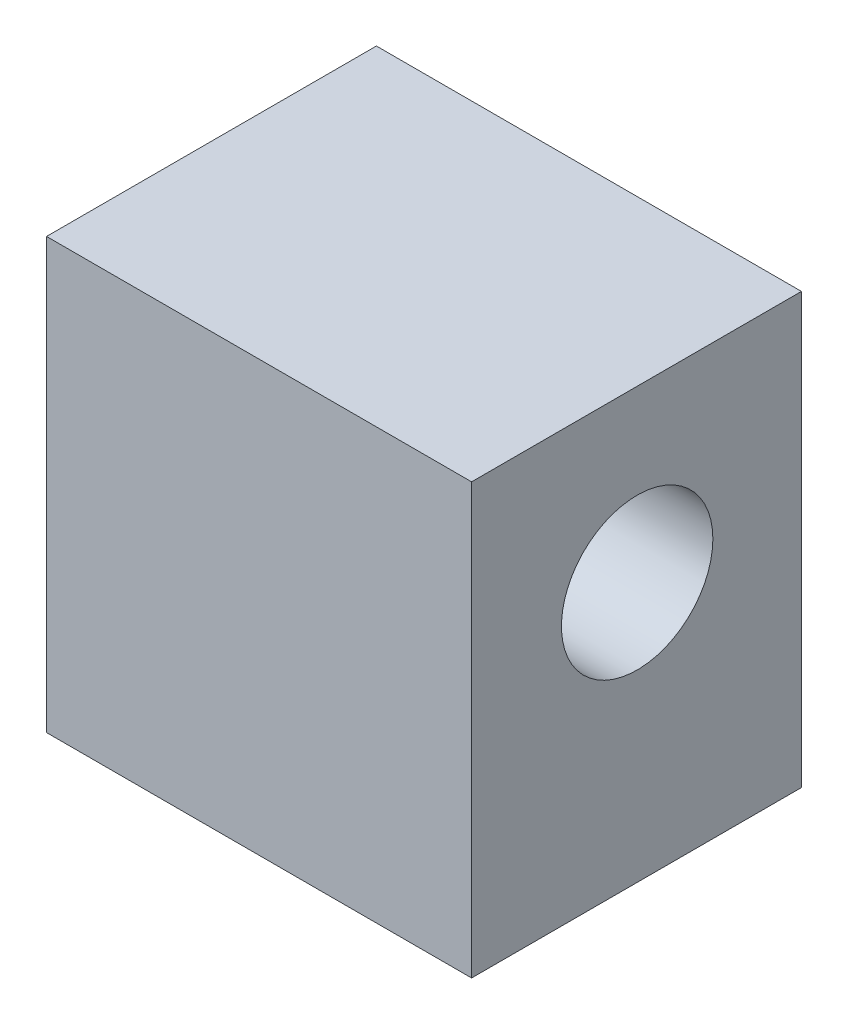
ISO-10303-21;
HEADER;
FILE_DESCRIPTION(('STEP AP214'),'2;1');
FILE_NAME('part.step','',(''),(''),'','','');
FILE_SCHEMA(('AUTOMOTIVE_DESIGN { 1 0 10303 214 1 1 1 1 }'));
ENDSEC;
DATA;
#1=APPLICATION_CONTEXT('core data for automotive mechanical design processes');
#2=APPLICATION_PROTOCOL_DEFINITION('international standard','automotive_design',2000,#1);
#3=PRODUCT_CONTEXT('',#1,'mechanical');
#4=PRODUCT('Part','Part','',(#3));
#5=PRODUCT_RELATED_PRODUCT_CATEGORY('part','',(#4));
#6=PRODUCT_DEFINITION_FORMATION('','',#4);
#7=PRODUCT_DEFINITION_CONTEXT('part definition',#1,'design');
#8=PRODUCT_DEFINITION('design','',#6,#7);
#9=PRODUCT_DEFINITION_SHAPE('','',#8);
#10=(LENGTH_UNIT() NAMED_UNIT(*) SI_UNIT(.MILLI.,.METRE.));
#11=(NAMED_UNIT(*) PLANE_ANGLE_UNIT() SI_UNIT($,.RADIAN.));
#12=(NAMED_UNIT(*) SI_UNIT($,.STERADIAN.) SOLID_ANGLE_UNIT());
#13=UNCERTAINTY_MEASURE_WITH_UNIT(LENGTH_MEASURE(1.E-05),#10,'distance_accuracy_value','');
#14=(GEOMETRIC_REPRESENTATION_CONTEXT(3) GLOBAL_UNCERTAINTY_ASSIGNED_CONTEXT((#13)) GLOBAL_UNIT_ASSIGNED_CONTEXT((#10,
#11,#12)) REPRESENTATION_CONTEXT('',''));
#15=CARTESIAN_POINT('',(0.,0.,0.));
#16=DIRECTION('',(0.,0.,1.));
#17=DIRECTION('',(1.,0.,0.));
#18=AXIS2_PLACEMENT_3D('',#15,#16,#17);
#19=CARTESIAN_POINT('',(-168.445557362055,172.588866626688,150.));
#20=DIRECTION('',(1.,0.,0.));
#21=DIRECTION('',(0.,1.,0.));
#22=AXIS2_PLACEMENT_3D('',#19,#20,#21);
#23=PLANE('',#22);
#24=CARTESIAN_POINT('',(-168.445557362055,95.259520614376,74.708195537043));
#25=DIRECTION('',(1.,0.,0.));
#26=DIRECTION('',(0.,0.,-1.));
#27=AXIS2_PLACEMENT_3D('',#24,#25,#26);
#28=CIRCLE('',#27,34.4330595447627);
#29=CARTESIAN_POINT('',(-168.445557362055,95.259520614376,40.2751359922802));
#30=VERTEX_POINT('',#29);
#31=EDGE_CURVE('E114',#30,#30,#28,.T.);
#32=ORIENTED_EDGE('',*,*,#31,.T.);
#33=EDGE_LOOP('',(#32));
#34=FACE_BOUND('',#33,.T.);
#35=DIRECTION('',(0.,-1.,0.));
#36=VECTOR('',#35,1.);
#37=CARTESIAN_POINT('',(-168.445557362055,172.588866626688,0.));
#38=LINE('',#37,#36);
#39=CARTESIAN_POINT('',(-168.445557362055,172.588866626688,0.));
#40=VERTEX_POINT('',#39);
#41=CARTESIAN_POINT('',(-168.445557362055,-22.8271193615489,0.));
#42=VERTEX_POINT('',#41);
#43=EDGE_CURVE('E110',#40,#42,#38,.T.);
#44=ORIENTED_EDGE('',*,*,#43,.T.);
#45=DIRECTION('',(0.,0.,-1.));
#46=VECTOR('',#45,1.);
#47=CARTESIAN_POINT('',(-168.445557362055,-22.8271193615489,150.));
#48=LINE('',#47,#46);
#49=CARTESIAN_POINT('',(-168.445557362055,-22.8271193615489,150.));
#50=VERTEX_POINT('',#49);
#51=EDGE_CURVE('E11',#50,#42,#48,.T.);
#52=ORIENTED_EDGE('',*,*,#51,.F.);
#53=DIRECTION('',(0.,-1.,0.));
#54=VECTOR('',#53,1.);
#55=CARTESIAN_POINT('',(-168.445557362055,172.588866626688,150.));
#56=LINE('',#55,#54);
#57=CARTESIAN_POINT('',(-168.445557362055,172.588866626688,150.));
#58=VERTEX_POINT('',#57);
#59=EDGE_CURVE('E94',#58,#50,#56,.T.);
#60=ORIENTED_EDGE('',*,*,#59,.F.);
#61=DIRECTION('',(0.,0.,-1.));
#62=VECTOR('',#61,1.);
#63=CARTESIAN_POINT('',(-168.445557362055,172.588866626688,150.));
#64=LINE('',#63,#62);
#65=EDGE_CURVE('E106',#58,#40,#64,.T.);
#66=ORIENTED_EDGE('',*,*,#65,.T.);
#67=EDGE_LOOP('',(#44,#52,#60,#66));
#68=FACE_BOUND('',#67,.T.);
#69=ADVANCED_FACE('F42',(#34,#68),#23,.F.);
#70=CARTESIAN_POINT('',(-168.445557362055,-22.8271193615489,150.));
#71=DIRECTION('',(0.,1.,0.));
#72=DIRECTION('',(0.,0.,1.));
#73=AXIS2_PLACEMENT_3D('',#70,#71,#72);
#74=PLANE('',#73);
#75=DIRECTION('',(1.,0.,0.));
#76=VECTOR('',#75,1.);
#77=CARTESIAN_POINT('',(-168.445557362055,-22.8271193615489,0.));
#78=LINE('',#77,#76);
#79=CARTESIAN_POINT('',(24.8521057565251,-22.8271193615489,0.));
#80=VERTEX_POINT('',#79);
#81=EDGE_CURVE('E99',#42,#80,#78,.T.);
#82=ORIENTED_EDGE('',*,*,#81,.T.);
#83=DIRECTION('',(0.,0.,-1.));
#84=VECTOR('',#83,1.);
#85=CARTESIAN_POINT('',(24.8521057565251,-22.8271193615489,150.));
#86=LINE('',#85,#84);
#87=CARTESIAN_POINT('',(24.8521057565251,-22.8271193615489,150.));
#88=VERTEX_POINT('',#87);
#89=EDGE_CURVE('E51',#88,#80,#86,.T.);
#90=ORIENTED_EDGE('',*,*,#89,.F.);
#91=DIRECTION('',(1.,0.,0.));
#92=VECTOR('',#91,1.);
#93=CARTESIAN_POINT('',(-168.445557362055,-22.8271193615489,150.));
#94=LINE('',#93,#92);
#95=EDGE_CURVE('E89',#50,#88,#94,.T.);
#96=ORIENTED_EDGE('',*,*,#95,.F.);
#97=ORIENTED_EDGE('',*,*,#51,.T.);
#98=EDGE_LOOP('',(#82,#90,#96,#97));
#99=FACE_BOUND('',#98,.T.);
#100=ADVANCED_FACE('F98',(#99),#74,.F.);
#101=CARTESIAN_POINT('',(24.8521057565251,172.588866626688,150.));
#102=DIRECTION('',(-1.,0.,0.));
#103=DIRECTION('',(0.,0.,1.));
#104=AXIS2_PLACEMENT_3D('',#101,#102,#103);
#105=PLANE('',#104);
#106=CARTESIAN_POINT('',(24.8521057565251,95.259520614376,74.708195537043));
#107=DIRECTION('',(1.,0.,0.));
#108=DIRECTION('',(0.,0.,-1.));
#109=AXIS2_PLACEMENT_3D('',#106,#107,#108);
#110=CIRCLE('',#109,34.4330595447627);
#111=CARTESIAN_POINT('',(24.8521057565251,95.259520614376,40.2751359922802));
#112=VERTEX_POINT('',#111);
#113=EDGE_CURVE('E131',#112,#112,#110,.T.);
#114=ORIENTED_EDGE('',*,*,#113,.F.);
#115=EDGE_LOOP('',(#114));
#116=FACE_BOUND('',#115,.T.);
#117=DIRECTION('',(0.,1.,0.));
#118=VECTOR('',#117,1.);
#119=CARTESIAN_POINT('',(24.8521057565251,172.588866626688,0.));
#120=LINE('',#119,#118);
#121=CARTESIAN_POINT('',(24.8521057565251,172.588866626688,0.));
#122=VERTEX_POINT('',#121);
#123=EDGE_CURVE('E76',#80,#122,#120,.T.);
#124=ORIENTED_EDGE('',*,*,#123,.T.);
#125=DIRECTION('',(0.,0.,-1.));
#126=VECTOR('',#125,1.);
#127=CARTESIAN_POINT('',(24.8521057565251,172.588866626688,150.));
#128=LINE('',#127,#126);
#129=CARTESIAN_POINT('',(24.8521057565251,172.588866626688,150.));
#130=VERTEX_POINT('',#129);
#131=EDGE_CURVE('E101',#130,#122,#128,.T.);
#132=ORIENTED_EDGE('',*,*,#131,.F.);
#133=DIRECTION('',(0.,1.,0.));
#134=VECTOR('',#133,1.);
#135=CARTESIAN_POINT('',(24.8521057565251,172.588866626688,150.));
#136=LINE('',#135,#134);
#137=EDGE_CURVE('E92',#88,#130,#136,.T.);
#138=ORIENTED_EDGE('',*,*,#137,.F.);
#139=ORIENTED_EDGE('',*,*,#89,.T.);
#140=EDGE_LOOP('',(#124,#132,#138,#139));
#141=FACE_BOUND('',#140,.T.);
#142=ADVANCED_FACE('F102',(#116,#141),#105,.F.);
#143=CARTESIAN_POINT('',(-168.445557362055,172.588866626688,150.));
#144=DIRECTION('',(0.,-1.,0.));
#145=DIRECTION('',(0.,0.,-1.));
#146=AXIS2_PLACEMENT_3D('',#143,#144,#145);
#147=PLANE('',#146);
#148=DIRECTION('',(-1.,0.,0.));
#149=VECTOR('',#148,1.);
#150=CARTESIAN_POINT('',(-168.445557362055,172.588866626688,0.));
#151=LINE('',#150,#149);
#152=EDGE_CURVE('E82',#122,#40,#151,.T.);
#153=ORIENTED_EDGE('',*,*,#152,.T.);
#154=ORIENTED_EDGE('',*,*,#65,.F.);
#155=DIRECTION('',(-1.,0.,0.));
#156=VECTOR('',#155,1.);
#157=CARTESIAN_POINT('',(-168.445557362055,172.588866626688,150.));
#158=LINE('',#157,#156);
#159=EDGE_CURVE('E59',#130,#58,#158,.T.);
#160=ORIENTED_EDGE('',*,*,#159,.F.);
#161=ORIENTED_EDGE('',*,*,#131,.T.);
#162=EDGE_LOOP('',(#153,#154,#160,#161));
#163=FACE_BOUND('',#162,.T.);
#164=ADVANCED_FACE('F124',(#163),#147,.F.);
#165=CARTESIAN_POINT('',(0.,0.,150.));
#166=DIRECTION('',(0.,0.,1.));
#167=DIRECTION('',(1.,0.,0.));
#168=AXIS2_PLACEMENT_3D('',#165,#166,#167);
#169=PLANE('',#168);
#170=ORIENTED_EDGE('',*,*,#59,.T.);
#171=ORIENTED_EDGE('',*,*,#95,.T.);
#172=ORIENTED_EDGE('',*,*,#137,.T.);
#173=ORIENTED_EDGE('',*,*,#159,.T.);
#174=EDGE_LOOP('',(#170,#171,#172,#173));
#175=FACE_BOUND('',#174,.T.);
#176=ADVANCED_FACE('F90',(#175),#169,.T.);
#177=CARTESIAN_POINT('',(0.,0.,0.));
#178=DIRECTION('',(0.,0.,1.));
#179=DIRECTION('',(1.,0.,0.));
#180=AXIS2_PLACEMENT_3D('',#177,#178,#179);
#181=PLANE('',#180);
#182=ORIENTED_EDGE('',*,*,#43,.F.);
#183=ORIENTED_EDGE('',*,*,#152,.F.);
#184=ORIENTED_EDGE('',*,*,#123,.F.);
#185=ORIENTED_EDGE('',*,*,#81,.F.);
#186=EDGE_LOOP('',(#182,#183,#184,#185));
#187=FACE_BOUND('',#186,.T.);
#188=ADVANCED_FACE('F127',(#187),#181,.F.);
#189=CARTESIAN_POINT('',(-168.445557362055,95.259520614376,74.708195537043));
#190=DIRECTION('',(1.,0.,0.));
#191=DIRECTION('',(0.,0.,-1.));
#192=AXIS2_PLACEMENT_3D('',#189,#190,#191);
#193=CYLINDRICAL_SURFACE('',#192,34.4330595447627);
#194=ORIENTED_EDGE('',*,*,#31,.F.);
#195=EDGE_LOOP('',(#194));
#196=FACE_BOUND('',#195,.T.);
#197=ORIENTED_EDGE('',*,*,#113,.T.);
#198=EDGE_LOOP('',(#197));
#199=FACE_BOUND('',#198,.T.);
#200=ADVANCED_FACE('F140',(#196,#199),#193,.F.);
#201=CLOSED_SHELL('',(#69,#100,#142,#164,#176,#188,#200));
#202=MANIFOLD_SOLID_BREP('B2',#201);
#203=ADVANCED_BREP_SHAPE_REPRESENTATION('',(#18,#202),#14);
#204=SHAPE_DEFINITION_REPRESENTATION(#9,#203);
ENDSEC;
END-ISO-10303-21;
